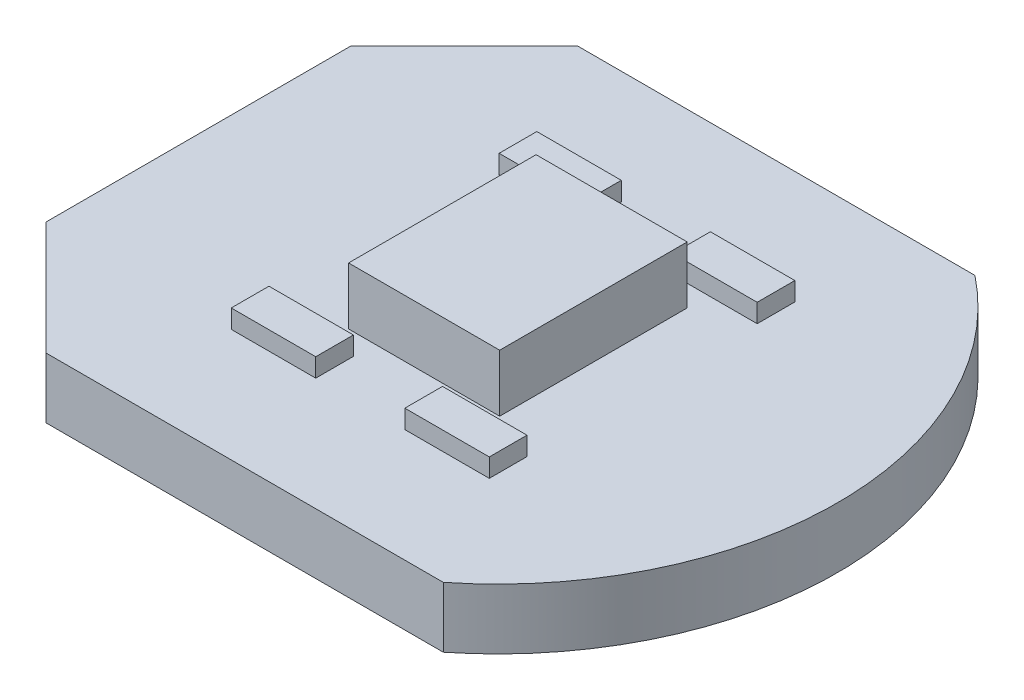
ISO-10303-21;
HEADER;
FILE_DESCRIPTION(('STEP AP214'),'2;1');
FILE_NAME('part.step','',(''),(''),'','','');
FILE_SCHEMA(('AUTOMOTIVE_DESIGN { 1 0 10303 214 1 1 1 1 }'));
ENDSEC;
DATA;
#1=APPLICATION_CONTEXT('core data for automotive mechanical design processes');
#2=APPLICATION_PROTOCOL_DEFINITION('international standard','automotive_design',2000,#1);
#3=PRODUCT_CONTEXT('',#1,'mechanical');
#4=PRODUCT('Part','Part','',(#3));
#5=PRODUCT_RELATED_PRODUCT_CATEGORY('part','',(#4));
#6=PRODUCT_DEFINITION_FORMATION('','',#4);
#7=PRODUCT_DEFINITION_CONTEXT('part definition',#1,'design');
#8=PRODUCT_DEFINITION('design','',#6,#7);
#9=PRODUCT_DEFINITION_SHAPE('','',#8);
#10=(LENGTH_UNIT() NAMED_UNIT(*) SI_UNIT(.MILLI.,.METRE.));
#11=(NAMED_UNIT(*) PLANE_ANGLE_UNIT() SI_UNIT($,.RADIAN.));
#12=(NAMED_UNIT(*) SI_UNIT($,.STERADIAN.) SOLID_ANGLE_UNIT());
#13=UNCERTAINTY_MEASURE_WITH_UNIT(LENGTH_MEASURE(1.E-05),#10,'distance_accuracy_value','');
#14=(GEOMETRIC_REPRESENTATION_CONTEXT(3) GLOBAL_UNCERTAINTY_ASSIGNED_CONTEXT((#13)) GLOBAL_UNIT_ASSIGNED_CONTEXT((#10,
#11,#12)) REPRESENTATION_CONTEXT('',''));
#15=CARTESIAN_POINT('',(0.,0.,0.));
#16=DIRECTION('',(0.,0.,1.));
#17=DIRECTION('',(1.,0.,0.));
#18=AXIS2_PLACEMENT_3D('',#15,#16,#17);
#19=CARTESIAN_POINT('',(-0.541544862518075,1.63,0.));
#20=DIRECTION('',(0.,-1.,0.));
#21=DIRECTION('',(0.,0.,-1.));
#22=AXIS2_PLACEMENT_3D('',#19,#20,#21);
#23=PLANE('',#22);
#24=DIRECTION('',(0.,0.,1.));
#25=VECTOR('',#24,1.);
#26=CARTESIAN_POINT('',(-3.605,1.63,-4.115));
#27=LINE('',#26,#25);
#28=CARTESIAN_POINT('',(-3.605,1.63,-4.115));
#29=VERTEX_POINT('',#28);
#30=CARTESIAN_POINT('',(-3.605,1.63,-3.1));
#31=VERTEX_POINT('',#30);
#32=EDGE_CURVE('E227',#29,#31,#27,.T.);
#33=ORIENTED_EDGE('',*,*,#32,.F.);
#34=DIRECTION('',(-1.,0.,0.));
#35=VECTOR('',#34,1.);
#36=CARTESIAN_POINT('',(-3.605,1.63,-4.115));
#37=LINE('',#36,#35);
#38=CARTESIAN_POINT('',(-1.33,1.63,-4.115));
#39=VERTEX_POINT('',#38);
#40=EDGE_CURVE('E240',#39,#29,#37,.T.);
#41=ORIENTED_EDGE('',*,*,#40,.F.);
#42=DIRECTION('',(0.,0.,-1.));
#43=VECTOR('',#42,1.);
#44=CARTESIAN_POINT('',(-1.33,1.63,-4.115));
#45=LINE('',#44,#43);
#46=CARTESIAN_POINT('',(-1.33,1.63,-3.1));
#47=VERTEX_POINT('',#46);
#48=EDGE_CURVE('E249',#47,#39,#45,.T.);
#49=ORIENTED_EDGE('',*,*,#48,.F.);
#50=DIRECTION('',(1.,0.,0.));
#51=VECTOR('',#50,1.);
#52=CARTESIAN_POINT('',(-3.605,1.63,-3.1));
#53=LINE('',#52,#51);
#54=EDGE_CURVE('E230',#31,#47,#53,.T.);
#55=ORIENTED_EDGE('',*,*,#54,.F.);
#56=EDGE_LOOP('',(#33,#41,#49,#55));
#57=FACE_BOUND('',#56,.T.);
#58=DIRECTION('',(0.,0.,-1.));
#59=VECTOR('',#58,1.);
#60=CARTESIAN_POINT('',(3.345,1.63,-4.115));
#61=LINE('',#60,#59);
#62=CARTESIAN_POINT('',(3.345,1.63,-3.1));
#63=VERTEX_POINT('',#62);
#64=CARTESIAN_POINT('',(3.345,1.63,-4.115));
#65=VERTEX_POINT('',#64);
#66=EDGE_CURVE('E298',#63,#65,#61,.T.);
#67=ORIENTED_EDGE('',*,*,#66,.F.);
#68=DIRECTION('',(1.,0.,0.));
#69=VECTOR('',#68,1.);
#70=CARTESIAN_POINT('',(3.345,1.63,-3.1));
#71=LINE('',#70,#69);
#72=CARTESIAN_POINT('',(1.07,1.63,-3.1));
#73=VERTEX_POINT('',#72);
#74=EDGE_CURVE('E303',#73,#63,#71,.T.);
#75=ORIENTED_EDGE('',*,*,#74,.F.);
#76=DIRECTION('',(0.,0.,1.));
#77=VECTOR('',#76,1.);
#78=CARTESIAN_POINT('',(1.07,1.63,-4.115));
#79=LINE('',#78,#77);
#80=CARTESIAN_POINT('',(1.07,1.63,-4.115));
#81=VERTEX_POINT('',#80);
#82=EDGE_CURVE('E315',#81,#73,#79,.T.);
#83=ORIENTED_EDGE('',*,*,#82,.F.);
#84=DIRECTION('',(-1.,0.,0.));
#85=VECTOR('',#84,1.);
#86=CARTESIAN_POINT('',(3.345,1.63,-4.115));
#87=LINE('',#86,#85);
#88=EDGE_CURVE('E312',#65,#81,#87,.T.);
#89=ORIENTED_EDGE('',*,*,#88,.F.);
#90=EDGE_LOOP('',(#67,#75,#83,#89));
#91=FACE_BOUND('',#90,.T.);
#92=DIRECTION('',(-0.707106781186546,0.,0.707106781186549));
#93=VECTOR('',#92,1.);
#94=CARTESIAN_POINT('',(-8.605,1.63,-4.105));
#95=LINE('',#94,#93);
#96=CARTESIAN_POINT('',(-5.55000000000001,1.63,-7.16));
#97=VERTEX_POINT('',#96);
#98=CARTESIAN_POINT('',(-8.605,1.63,-4.105));
#99=VERTEX_POINT('',#98);
#100=EDGE_CURVE('E365',#97,#99,#95,.T.);
#101=ORIENTED_EDGE('',*,*,#100,.T.);
#102=DIRECTION('',(0.,0.,1.));
#103=VECTOR('',#102,1.);
#104=CARTESIAN_POINT('',(-8.605,1.63,-4.105));
#105=LINE('',#104,#103);
#106=CARTESIAN_POINT('',(-8.605,1.63,4.105));
#107=VERTEX_POINT('',#106);
#108=EDGE_CURVE('E368',#99,#107,#105,.T.);
#109=ORIENTED_EDGE('',*,*,#108,.T.);
#110=DIRECTION('',(0.707106781186546,0.,0.707106781186549));
#111=VECTOR('',#110,1.);
#112=CARTESIAN_POINT('',(-8.605,1.63,4.105));
#113=LINE('',#112,#111);
#114=CARTESIAN_POINT('',(-5.55000000000001,1.63,7.16));
#115=VERTEX_POINT('',#114);
#116=EDGE_CURVE('E371',#107,#115,#113,.T.);
#117=ORIENTED_EDGE('',*,*,#116,.T.);
#118=DIRECTION('',(1.,0.,0.));
#119=VECTOR('',#118,1.);
#120=CARTESIAN_POINT('',(-5.55000000000001,1.63,7.16));
#121=LINE('',#120,#119);
#122=CARTESIAN_POINT('',(5.14999999999999,1.63,7.16));
#123=VERTEX_POINT('',#122);
#124=EDGE_CURVE('E373',#115,#123,#121,.T.);
#125=ORIENTED_EDGE('',*,*,#124,.T.);
#126=CARTESIAN_POINT('',(-0.541544862518075,1.63,0.));
#127=DIRECTION('',(0.,1.,0.));
#128=DIRECTION('',(0.,0.,-1.));
#129=AXIS2_PLACEMENT_3D('',#126,#127,#128);
#130=CIRCLE('',#129,9.14654486251808);
#131=CARTESIAN_POINT('',(5.14999999999999,1.63,-7.16));
#132=VERTEX_POINT('',#131);
#133=EDGE_CURVE('E375',#123,#132,#130,.T.);
#134=ORIENTED_EDGE('',*,*,#133,.T.);
#135=DIRECTION('',(-1.,0.,0.));
#136=VECTOR('',#135,1.);
#137=CARTESIAN_POINT('',(-5.55000000000001,1.63,-7.16));
#138=LINE('',#137,#136);
#139=EDGE_CURVE('E377',#132,#97,#138,.T.);
#140=ORIENTED_EDGE('',*,*,#139,.T.);
#141=EDGE_LOOP('',(#101,#109,#117,#125,#134,#140));
#142=FACE_BOUND('',#141,.T.);
#143=DIRECTION('',(0.,0.,-1.));
#144=VECTOR('',#143,1.);
#145=CARTESIAN_POINT('',(2.035,1.63,2.525));
#146=LINE('',#145,#144);
#147=CARTESIAN_POINT('',(2.035,1.63,2.525));
#148=VERTEX_POINT('',#147);
#149=CARTESIAN_POINT('',(2.035,1.63,-2.525));
#150=VERTEX_POINT('',#149);
#151=EDGE_CURVE('E331',#148,#150,#146,.T.);
#152=ORIENTED_EDGE('',*,*,#151,.F.);
#153=DIRECTION('',(1.,0.,0.));
#154=VECTOR('',#153,1.);
#155=CARTESIAN_POINT('',(-2.035,1.63,2.525));
#156=LINE('',#155,#154);
#157=CARTESIAN_POINT('',(-2.035,1.63,2.525));
#158=VERTEX_POINT('',#157);
#159=EDGE_CURVE('E336',#158,#148,#156,.T.);
#160=ORIENTED_EDGE('',*,*,#159,.F.);
#161=DIRECTION('',(0.,0.,1.));
#162=VECTOR('',#161,1.);
#163=CARTESIAN_POINT('',(-2.035,1.63,2.525));
#164=LINE('',#163,#162);
#165=CARTESIAN_POINT('',(-2.035,1.63,-2.525));
#166=VERTEX_POINT('',#165);
#167=EDGE_CURVE('E348',#166,#158,#164,.T.);
#168=ORIENTED_EDGE('',*,*,#167,.F.);
#169=DIRECTION('',(-1.,0.,0.));
#170=VECTOR('',#169,1.);
#171=CARTESIAN_POINT('',(-2.035,1.63,-2.525));
#172=LINE('',#171,#170);
#173=EDGE_CURVE('E345',#150,#166,#172,.T.);
#174=ORIENTED_EDGE('',*,*,#173,.F.);
#175=EDGE_LOOP('',(#152,#160,#168,#174));
#176=FACE_BOUND('',#175,.T.);
#177=DIRECTION('',(0.,0.,1.));
#178=VECTOR('',#177,1.);
#179=CARTESIAN_POINT('',(-3.605,1.63,4.115));
#180=LINE('',#179,#178);
#181=CARTESIAN_POINT('',(-3.605,1.63,3.1));
#182=VERTEX_POINT('',#181);
#183=CARTESIAN_POINT('',(-3.605,1.63,4.115));
#184=VERTEX_POINT('',#183);
#185=EDGE_CURVE('E265',#182,#184,#180,.T.);
#186=ORIENTED_EDGE('',*,*,#185,.F.);
#187=DIRECTION('',(-1.,0.,0.));
#188=VECTOR('',#187,1.);
#189=CARTESIAN_POINT('',(-3.605,1.63,3.1));
#190=LINE('',#189,#188);
#191=CARTESIAN_POINT('',(-1.33,1.63,3.1));
#192=VERTEX_POINT('',#191);
#193=EDGE_CURVE('E270',#192,#182,#190,.T.);
#194=ORIENTED_EDGE('',*,*,#193,.F.);
#195=DIRECTION('',(0.,0.,-1.));
#196=VECTOR('',#195,1.);
#197=CARTESIAN_POINT('',(-1.33,1.63,4.115));
#198=LINE('',#197,#196);
#199=CARTESIAN_POINT('',(-1.33,1.63,4.115));
#200=VERTEX_POINT('',#199);
#201=EDGE_CURVE('E282',#200,#192,#198,.T.);
#202=ORIENTED_EDGE('',*,*,#201,.F.);
#203=DIRECTION('',(1.,0.,0.));
#204=VECTOR('',#203,1.);
#205=CARTESIAN_POINT('',(-3.605,1.63,4.115));
#206=LINE('',#205,#204);
#207=EDGE_CURVE('E279',#184,#200,#206,.T.);
#208=ORIENTED_EDGE('',*,*,#207,.F.);
#209=EDGE_LOOP('',(#186,#194,#202,#208));
#210=FACE_BOUND('',#209,.T.);
#211=DIRECTION('',(0.,0.,-1.));
#212=VECTOR('',#211,1.);
#213=CARTESIAN_POINT('',(3.345,1.63,4.115));
#214=LINE('',#213,#212);
#215=CARTESIAN_POINT('',(3.345,1.63,4.115));
#216=VERTEX_POINT('',#215);
#217=CARTESIAN_POINT('',(3.345,1.63,3.1));
#218=VERTEX_POINT('',#217);
#219=EDGE_CURVE('E226',#216,#218,#214,.T.);
#220=ORIENTED_EDGE('',*,*,#219,.F.);
#221=DIRECTION('',(1.,0.,0.));
#222=VECTOR('',#221,1.);
#223=CARTESIAN_POINT('',(3.345,1.63,4.115));
#224=LINE('',#223,#222);
#225=CARTESIAN_POINT('',(1.07,1.63,4.115));
#226=VERTEX_POINT('',#225);
#227=EDGE_CURVE('E223',#226,#216,#224,.T.);
#228=ORIENTED_EDGE('',*,*,#227,.F.);
#229=DIRECTION('',(0.,0.,1.));
#230=VECTOR('',#229,1.);
#231=CARTESIAN_POINT('',(1.07,1.63,4.115));
#232=LINE('',#231,#230);
#233=CARTESIAN_POINT('',(1.07,1.63,3.1));
#234=VERTEX_POINT('',#233);
#235=EDGE_CURVE('E53',#234,#226,#232,.T.);
#236=ORIENTED_EDGE('',*,*,#235,.F.);
#237=DIRECTION('',(-1.,0.,0.));
#238=VECTOR('',#237,1.);
#239=CARTESIAN_POINT('',(3.345,1.63,3.1));
#240=LINE('',#239,#238);
#241=EDGE_CURVE('E48',#218,#234,#240,.T.);
#242=ORIENTED_EDGE('',*,*,#241,.F.);
#243=EDGE_LOOP('',(#220,#228,#236,#242));
#244=FACE_BOUND('',#243,.T.);
#245=ADVANCED_FACE('F33',(#57,#91,#142,#176,#210,#244),#23,.F.);
#246=CARTESIAN_POINT('',(-8.605,1.63,-4.105));
#247=DIRECTION('',(0.707106781186549,0.,0.707106781186546));
#248=DIRECTION('',(0.707106781186546,0.,-0.707106781186549));
#249=AXIS2_PLACEMENT_3D('',#246,#247,#248);
#250=PLANE('',#249);
#251=DIRECTION('',(-0.707106781186546,0.,0.707106781186549));
#252=VECTOR('',#251,1.);
#253=CARTESIAN_POINT('',(-8.605,0.,-4.105));
#254=LINE('',#253,#252);
#255=CARTESIAN_POINT('',(-5.55000000000001,0.,-7.16));
#256=VERTEX_POINT('',#255);
#257=CARTESIAN_POINT('',(-8.605,0.,-4.105));
#258=VERTEX_POINT('',#257);
#259=EDGE_CURVE('E364',#256,#258,#254,.T.);
#260=ORIENTED_EDGE('',*,*,#259,.T.);
#261=DIRECTION('',(0.,-1.,0.));
#262=VECTOR('',#261,1.);
#263=CARTESIAN_POINT('',(-8.605,1.63,-4.105));
#264=LINE('',#263,#262);
#265=EDGE_CURVE('E11',#99,#258,#264,.T.);
#266=ORIENTED_EDGE('',*,*,#265,.F.);
#267=ORIENTED_EDGE('',*,*,#100,.F.);
#268=DIRECTION('',(0.,-1.,0.));
#269=VECTOR('',#268,1.);
#270=CARTESIAN_POINT('',(-5.55000000000001,1.63,-7.16));
#271=LINE('',#270,#269);
#272=EDGE_CURVE('E379',#97,#256,#271,.T.);
#273=ORIENTED_EDGE('',*,*,#272,.T.);
#274=EDGE_LOOP('',(#260,#266,#267,#273));
#275=FACE_BOUND('',#274,.T.);
#276=ADVANCED_FACE('F35',(#275),#250,.F.);
#277=CARTESIAN_POINT('',(-8.605,1.63,-4.105));
#278=DIRECTION('',(1.,0.,0.));
#279=DIRECTION('',(0.,0.,-1.));
#280=AXIS2_PLACEMENT_3D('',#277,#278,#279);
#281=PLANE('',#280);
#282=DIRECTION('',(0.,0.,1.));
#283=VECTOR('',#282,1.);
#284=CARTESIAN_POINT('',(-8.605,0.,-4.105));
#285=LINE('',#284,#283);
#286=CARTESIAN_POINT('',(-8.605,0.,4.105));
#287=VERTEX_POINT('',#286);
#288=EDGE_CURVE('E382',#258,#287,#285,.T.);
#289=ORIENTED_EDGE('',*,*,#288,.T.);
#290=DIRECTION('',(0.,-1.,0.));
#291=VECTOR('',#290,1.);
#292=CARTESIAN_POINT('',(-8.605,1.63,4.105));
#293=LINE('',#292,#291);
#294=EDGE_CURVE('E41',#107,#287,#293,.T.);
#295=ORIENTED_EDGE('',*,*,#294,.F.);
#296=ORIENTED_EDGE('',*,*,#108,.F.);
#297=ORIENTED_EDGE('',*,*,#265,.T.);
#298=EDGE_LOOP('',(#289,#295,#296,#297));
#299=FACE_BOUND('',#298,.T.);
#300=ADVANCED_FACE('F429',(#299),#281,.F.);
#301=CARTESIAN_POINT('',(-8.605,1.63,4.105));
#302=DIRECTION('',(0.707106781186549,0.,-0.707106781186546));
#303=DIRECTION('',(-0.707106781186546,0.,-0.707106781186549));
#304=AXIS2_PLACEMENT_3D('',#301,#302,#303);
#305=PLANE('',#304);
#306=DIRECTION('',(0.707106781186546,0.,0.707106781186549));
#307=VECTOR('',#306,1.);
#308=CARTESIAN_POINT('',(-8.605,0.,4.105));
#309=LINE('',#308,#307);
#310=CARTESIAN_POINT('',(-5.55000000000001,0.,7.16));
#311=VERTEX_POINT('',#310);
#312=EDGE_CURVE('E384',#287,#311,#309,.T.);
#313=ORIENTED_EDGE('',*,*,#312,.T.);
#314=DIRECTION('',(0.,-1.,0.));
#315=VECTOR('',#314,1.);
#316=CARTESIAN_POINT('',(-5.55000000000001,1.63,7.16));
#317=LINE('',#316,#315);
#318=EDGE_CURVE('E399',#115,#311,#317,.T.);
#319=ORIENTED_EDGE('',*,*,#318,.F.);
#320=ORIENTED_EDGE('',*,*,#116,.F.);
#321=ORIENTED_EDGE('',*,*,#294,.T.);
#322=EDGE_LOOP('',(#313,#319,#320,#321));
#323=FACE_BOUND('',#322,.T.);
#324=ADVANCED_FACE('F406',(#323),#305,.F.);
#325=CARTESIAN_POINT('',(-5.55000000000001,1.63,7.16));
#326=DIRECTION('',(0.,0.,-1.));
#327=DIRECTION('',(-1.,0.,0.));
#328=AXIS2_PLACEMENT_3D('',#325,#326,#327);
#329=PLANE('',#328);
#330=DIRECTION('',(1.,0.,0.));
#331=VECTOR('',#330,1.);
#332=CARTESIAN_POINT('',(-5.55000000000001,0.,7.16));
#333=LINE('',#332,#331);
#334=CARTESIAN_POINT('',(5.14999999999999,0.,7.16));
#335=VERTEX_POINT('',#334);
#336=EDGE_CURVE('E386',#311,#335,#333,.T.);
#337=ORIENTED_EDGE('',*,*,#336,.T.);
#338=DIRECTION('',(0.,-1.,0.));
#339=VECTOR('',#338,1.);
#340=CARTESIAN_POINT('',(5.14999999999999,1.63,7.16));
#341=LINE('',#340,#339);
#342=EDGE_CURVE('E396',#123,#335,#341,.T.);
#343=ORIENTED_EDGE('',*,*,#342,.F.);
#344=ORIENTED_EDGE('',*,*,#124,.F.);
#345=ORIENTED_EDGE('',*,*,#318,.T.);
#346=EDGE_LOOP('',(#337,#343,#344,#345));
#347=FACE_BOUND('',#346,.T.);
#348=ADVANCED_FACE('F417',(#347),#329,.F.);
#349=CARTESIAN_POINT('',(-0.541544862518075,1.63,0.));
#350=DIRECTION('',(0.,-1.,0.));
#351=DIRECTION('',(0.,0.,-1.));
#352=AXIS2_PLACEMENT_3D('',#349,#350,#351);
#353=CYLINDRICAL_SURFACE('',#352,9.14654486251808);
#354=CARTESIAN_POINT('',(-0.541544862518075,0.,0.));
#355=DIRECTION('',(0.,1.,0.));
#356=DIRECTION('',(0.,0.,-1.));
#357=AXIS2_PLACEMENT_3D('',#354,#355,#356);
#358=CIRCLE('',#357,9.14654486251808);
#359=CARTESIAN_POINT('',(5.14999999999999,0.,-7.16));
#360=VERTEX_POINT('',#359);
#361=EDGE_CURVE('E388',#335,#360,#358,.T.);
#362=ORIENTED_EDGE('',*,*,#361,.T.);
#363=DIRECTION('',(0.,-1.,0.));
#364=VECTOR('',#363,1.);
#365=CARTESIAN_POINT('',(5.14999999999999,1.63,-7.16));
#366=LINE('',#365,#364);
#367=EDGE_CURVE('E393',#132,#360,#366,.T.);
#368=ORIENTED_EDGE('',*,*,#367,.F.);
#369=ORIENTED_EDGE('',*,*,#133,.F.);
#370=ORIENTED_EDGE('',*,*,#342,.T.);
#371=EDGE_LOOP('',(#362,#368,#369,#370));
#372=FACE_BOUND('',#371,.T.);
#373=ADVANCED_FACE('F421',(#372),#353,.T.);
#374=CARTESIAN_POINT('',(-5.55000000000001,1.63,-7.16));
#375=DIRECTION('',(0.,0.,1.));
#376=DIRECTION('',(1.,0.,0.));
#377=AXIS2_PLACEMENT_3D('',#374,#375,#376);
#378=PLANE('',#377);
#379=DIRECTION('',(-1.,0.,0.));
#380=VECTOR('',#379,1.);
#381=CARTESIAN_POINT('',(-5.55000000000001,0.,-7.16));
#382=LINE('',#381,#380);
#383=EDGE_CURVE('E369',#360,#256,#382,.T.);
#384=ORIENTED_EDGE('',*,*,#383,.T.);
#385=ORIENTED_EDGE('',*,*,#272,.F.);
#386=ORIENTED_EDGE('',*,*,#139,.F.);
#387=ORIENTED_EDGE('',*,*,#367,.T.);
#388=EDGE_LOOP('',(#384,#385,#386,#387));
#389=FACE_BOUND('',#388,.T.);
#390=ADVANCED_FACE('F432',(#389),#378,.F.);
#391=CARTESIAN_POINT('',(-0.541544862518075,0.,0.));
#392=DIRECTION('',(0.,-1.,0.));
#393=DIRECTION('',(0.,0.,-1.));
#394=AXIS2_PLACEMENT_3D('',#391,#392,#393);
#395=PLANE('',#394);
#396=ORIENTED_EDGE('',*,*,#259,.F.);
#397=ORIENTED_EDGE('',*,*,#383,.F.);
#398=ORIENTED_EDGE('',*,*,#361,.F.);
#399=ORIENTED_EDGE('',*,*,#336,.F.);
#400=ORIENTED_EDGE('',*,*,#312,.F.);
#401=ORIENTED_EDGE('',*,*,#288,.F.);
#402=EDGE_LOOP('',(#396,#397,#398,#399,#400,#401));
#403=FACE_BOUND('',#402,.T.);
#404=ADVANCED_FACE('F412',(#403),#395,.T.);
#405=CARTESIAN_POINT('',(2.035,3.17,2.525));
#406=DIRECTION('',(-1.,0.,0.));
#407=DIRECTION('',(0.,0.,1.));
#408=AXIS2_PLACEMENT_3D('',#405,#406,#407);
#409=PLANE('',#408);
#410=ORIENTED_EDGE('',*,*,#151,.T.);
#411=DIRECTION('',(0.,-1.,0.));
#412=VECTOR('',#411,1.);
#413=CARTESIAN_POINT('',(2.035,3.17,-2.525));
#414=LINE('',#413,#412);
#415=CARTESIAN_POINT('',(2.035,3.17,-2.525));
#416=VERTEX_POINT('',#415);
#417=EDGE_CURVE('E361',#416,#150,#414,.T.);
#418=ORIENTED_EDGE('',*,*,#417,.F.);
#419=DIRECTION('',(0.,0.,-1.));
#420=VECTOR('',#419,1.);
#421=CARTESIAN_POINT('',(2.035,3.17,2.525));
#422=LINE('',#421,#420);
#423=CARTESIAN_POINT('',(2.035,3.17,2.525));
#424=VERTEX_POINT('',#423);
#425=EDGE_CURVE('E332',#424,#416,#422,.T.);
#426=ORIENTED_EDGE('',*,*,#425,.F.);
#427=DIRECTION('',(0.,-1.,0.));
#428=VECTOR('',#427,1.);
#429=CARTESIAN_POINT('',(2.035,3.17,2.525));
#430=LINE('',#429,#428);
#431=EDGE_CURVE('E342',#424,#148,#430,.T.);
#432=ORIENTED_EDGE('',*,*,#431,.T.);
#433=EDGE_LOOP('',(#410,#418,#426,#432));
#434=FACE_BOUND('',#433,.T.);
#435=ADVANCED_FACE('F439',(#434),#409,.F.);
#436=CARTESIAN_POINT('',(-2.035,3.17,-2.525));
#437=DIRECTION('',(0.,0.,1.));
#438=DIRECTION('',(1.,0.,0.));
#439=AXIS2_PLACEMENT_3D('',#436,#437,#438);
#440=PLANE('',#439);
#441=ORIENTED_EDGE('',*,*,#173,.T.);
#442=DIRECTION('',(0.,-1.,0.));
#443=VECTOR('',#442,1.);
#444=CARTESIAN_POINT('',(-2.035,3.17,-2.525));
#445=LINE('',#444,#443);
#446=CARTESIAN_POINT('',(-2.035,3.17,-2.525));
#447=VERTEX_POINT('',#446);
#448=EDGE_CURVE('E358',#447,#166,#445,.T.);
#449=ORIENTED_EDGE('',*,*,#448,.F.);
#450=DIRECTION('',(-1.,0.,0.));
#451=VECTOR('',#450,1.);
#452=CARTESIAN_POINT('',(-2.035,3.17,-2.525));
#453=LINE('',#452,#451);
#454=EDGE_CURVE('E335',#416,#447,#453,.T.);
#455=ORIENTED_EDGE('',*,*,#454,.F.);
#456=ORIENTED_EDGE('',*,*,#417,.T.);
#457=EDGE_LOOP('',(#441,#449,#455,#456));
#458=FACE_BOUND('',#457,.T.);
#459=ADVANCED_FACE('F452',(#458),#440,.F.);
#460=CARTESIAN_POINT('',(-2.035,3.17,2.525));
#461=DIRECTION('',(1.,0.,0.));
#462=DIRECTION('',(0.,0.,-1.));
#463=AXIS2_PLACEMENT_3D('',#460,#461,#462);
#464=PLANE('',#463);
#465=ORIENTED_EDGE('',*,*,#167,.T.);
#466=DIRECTION('',(0.,-1.,0.));
#467=VECTOR('',#466,1.);
#468=CARTESIAN_POINT('',(-2.035,3.17,2.525));
#469=LINE('',#468,#467);
#470=CARTESIAN_POINT('',(-2.035,3.17,2.525));
#471=VERTEX_POINT('',#470);
#472=EDGE_CURVE('E355',#471,#158,#469,.T.);
#473=ORIENTED_EDGE('',*,*,#472,.F.);
#474=DIRECTION('',(0.,0.,1.));
#475=VECTOR('',#474,1.);
#476=CARTESIAN_POINT('',(-2.035,3.17,2.525));
#477=LINE('',#476,#475);
#478=EDGE_CURVE('E338',#447,#471,#477,.T.);
#479=ORIENTED_EDGE('',*,*,#478,.F.);
#480=ORIENTED_EDGE('',*,*,#448,.T.);
#481=EDGE_LOOP('',(#465,#473,#479,#480));
#482=FACE_BOUND('',#481,.T.);
#483=ADVANCED_FACE('F456',(#482),#464,.F.);
#484=CARTESIAN_POINT('',(-2.035,3.17,2.525));
#485=DIRECTION('',(0.,0.,-1.));
#486=DIRECTION('',(-1.,0.,0.));
#487=AXIS2_PLACEMENT_3D('',#484,#485,#486);
#488=PLANE('',#487);
#489=ORIENTED_EDGE('',*,*,#159,.T.);
#490=ORIENTED_EDGE('',*,*,#431,.F.);
#491=DIRECTION('',(1.,0.,0.));
#492=VECTOR('',#491,1.);
#493=CARTESIAN_POINT('',(-2.035,3.17,2.525));
#494=LINE('',#493,#492);
#495=EDGE_CURVE('E340',#471,#424,#494,.T.);
#496=ORIENTED_EDGE('',*,*,#495,.F.);
#497=ORIENTED_EDGE('',*,*,#472,.T.);
#498=EDGE_LOOP('',(#489,#490,#496,#497));
#499=FACE_BOUND('',#498,.T.);
#500=ADVANCED_FACE('F460',(#499),#488,.F.);
#501=CARTESIAN_POINT('',(0.,3.17,0.));
#502=DIRECTION('',(0.,-1.,0.));
#503=DIRECTION('',(0.,0.,-1.));
#504=AXIS2_PLACEMENT_3D('',#501,#502,#503);
#505=PLANE('',#504);
#506=ORIENTED_EDGE('',*,*,#425,.T.);
#507=ORIENTED_EDGE('',*,*,#454,.T.);
#508=ORIENTED_EDGE('',*,*,#478,.T.);
#509=ORIENTED_EDGE('',*,*,#495,.T.);
#510=EDGE_LOOP('',(#506,#507,#508,#509));
#511=FACE_BOUND('',#510,.T.);
#512=ADVANCED_FACE('F464',(#511),#505,.F.);
#513=CARTESIAN_POINT('',(3.345,2.13,-4.115));
#514=DIRECTION('',(-1.,0.,0.));
#515=DIRECTION('',(0.,0.,1.));
#516=AXIS2_PLACEMENT_3D('',#513,#514,#515);
#517=PLANE('',#516);
#518=ORIENTED_EDGE('',*,*,#66,.T.);
#519=DIRECTION('',(0.,-1.,0.));
#520=VECTOR('',#519,1.);
#521=CARTESIAN_POINT('',(3.345,2.13,-4.115));
#522=LINE('',#521,#520);
#523=CARTESIAN_POINT('',(3.345,2.13,-4.115));
#524=VERTEX_POINT('',#523);
#525=EDGE_CURVE('E328',#524,#65,#522,.T.);
#526=ORIENTED_EDGE('',*,*,#525,.F.);
#527=DIRECTION('',(0.,0.,-1.));
#528=VECTOR('',#527,1.);
#529=CARTESIAN_POINT('',(3.345,2.13,-4.115));
#530=LINE('',#529,#528);
#531=CARTESIAN_POINT('',(3.345,2.13,-3.1));
#532=VERTEX_POINT('',#531);
#533=EDGE_CURVE('E299',#532,#524,#530,.T.);
#534=ORIENTED_EDGE('',*,*,#533,.F.);
#535=DIRECTION('',(0.,-1.,0.));
#536=VECTOR('',#535,1.);
#537=CARTESIAN_POINT('',(3.345,2.13,-3.1));
#538=LINE('',#537,#536);
#539=EDGE_CURVE('E309',#532,#63,#538,.T.);
#540=ORIENTED_EDGE('',*,*,#539,.T.);
#541=EDGE_LOOP('',(#518,#526,#534,#540));
#542=FACE_BOUND('',#541,.T.);
#543=ADVANCED_FACE('F468',(#542),#517,.F.);
#544=CARTESIAN_POINT('',(3.345,2.13,-4.115));
#545=DIRECTION('',(0.,0.,1.));
#546=DIRECTION('',(1.,0.,0.));
#547=AXIS2_PLACEMENT_3D('',#544,#545,#546);
#548=PLANE('',#547);
#549=ORIENTED_EDGE('',*,*,#88,.T.);
#550=DIRECTION('',(0.,-1.,0.));
#551=VECTOR('',#550,1.);
#552=CARTESIAN_POINT('',(1.07,2.13,-4.115));
#553=LINE('',#552,#551);
#554=CARTESIAN_POINT('',(1.07,2.13,-4.115));
#555=VERTEX_POINT('',#554);
#556=EDGE_CURVE('E325',#555,#81,#553,.T.);
#557=ORIENTED_EDGE('',*,*,#556,.F.);
#558=DIRECTION('',(-1.,0.,0.));
#559=VECTOR('',#558,1.);
#560=CARTESIAN_POINT('',(3.345,2.13,-4.115));
#561=LINE('',#560,#559);
#562=EDGE_CURVE('E302',#524,#555,#561,.T.);
#563=ORIENTED_EDGE('',*,*,#562,.F.);
#564=ORIENTED_EDGE('',*,*,#525,.T.);
#565=EDGE_LOOP('',(#549,#557,#563,#564));
#566=FACE_BOUND('',#565,.T.);
#567=ADVANCED_FACE('F472',(#566),#548,.F.);
#568=CARTESIAN_POINT('',(1.07,2.13,-4.115));
#569=DIRECTION('',(1.,0.,0.));
#570=DIRECTION('',(0.,0.,-1.));
#571=AXIS2_PLACEMENT_3D('',#568,#569,#570);
#572=PLANE('',#571);
#573=ORIENTED_EDGE('',*,*,#82,.T.);
#574=DIRECTION('',(0.,-1.,0.));
#575=VECTOR('',#574,1.);
#576=CARTESIAN_POINT('',(1.07,2.13,-3.1));
#577=LINE('',#576,#575);
#578=CARTESIAN_POINT('',(1.07,2.13,-3.1));
#579=VERTEX_POINT('',#578);
#580=EDGE_CURVE('E322',#579,#73,#577,.T.);
#581=ORIENTED_EDGE('',*,*,#580,.F.);
#582=DIRECTION('',(0.,0.,1.));
#583=VECTOR('',#582,1.);
#584=CARTESIAN_POINT('',(1.07,2.13,-4.115));
#585=LINE('',#584,#583);
#586=EDGE_CURVE('E305',#555,#579,#585,.T.);
#587=ORIENTED_EDGE('',*,*,#586,.F.);
#588=ORIENTED_EDGE('',*,*,#556,.T.);
#589=EDGE_LOOP('',(#573,#581,#587,#588));
#590=FACE_BOUND('',#589,.T.);
#591=ADVANCED_FACE('F476',(#590),#572,.F.);
#592=CARTESIAN_POINT('',(3.345,2.13,-3.1));
#593=DIRECTION('',(0.,0.,-1.));
#594=DIRECTION('',(-1.,0.,0.));
#595=AXIS2_PLACEMENT_3D('',#592,#593,#594);
#596=PLANE('',#595);
#597=ORIENTED_EDGE('',*,*,#74,.T.);
#598=ORIENTED_EDGE('',*,*,#539,.F.);
#599=DIRECTION('',(1.,0.,0.));
#600=VECTOR('',#599,1.);
#601=CARTESIAN_POINT('',(3.345,2.13,-3.1));
#602=LINE('',#601,#600);
#603=EDGE_CURVE('E307',#579,#532,#602,.T.);
#604=ORIENTED_EDGE('',*,*,#603,.F.);
#605=ORIENTED_EDGE('',*,*,#580,.T.);
#606=EDGE_LOOP('',(#597,#598,#604,#605));
#607=FACE_BOUND('',#606,.T.);
#608=ADVANCED_FACE('F480',(#607),#596,.F.);
#609=CARTESIAN_POINT('',(0.,2.13,0.));
#610=DIRECTION('',(0.,-1.,0.));
#611=DIRECTION('',(0.,0.,-1.));
#612=AXIS2_PLACEMENT_3D('',#609,#610,#611);
#613=PLANE('',#612);
#614=ORIENTED_EDGE('',*,*,#533,.T.);
#615=ORIENTED_EDGE('',*,*,#562,.T.);
#616=ORIENTED_EDGE('',*,*,#586,.T.);
#617=ORIENTED_EDGE('',*,*,#603,.T.);
#618=EDGE_LOOP('',(#614,#615,#616,#617));
#619=FACE_BOUND('',#618,.T.);
#620=ADVANCED_FACE('F484',(#619),#613,.F.);
#621=CARTESIAN_POINT('',(-3.605,2.13,4.115));
#622=DIRECTION('',(1.,0.,0.));
#623=DIRECTION('',(0.,0.,-1.));
#624=AXIS2_PLACEMENT_3D('',#621,#622,#623);
#625=PLANE('',#624);
#626=ORIENTED_EDGE('',*,*,#185,.T.);
#627=DIRECTION('',(0.,-1.,0.));
#628=VECTOR('',#627,1.);
#629=CARTESIAN_POINT('',(-3.605,2.13,4.115));
#630=LINE('',#629,#628);
#631=CARTESIAN_POINT('',(-3.605,2.13,4.115));
#632=VERTEX_POINT('',#631);
#633=EDGE_CURVE('E295',#632,#184,#630,.T.);
#634=ORIENTED_EDGE('',*,*,#633,.F.);
#635=DIRECTION('',(0.,0.,1.));
#636=VECTOR('',#635,1.);
#637=CARTESIAN_POINT('',(-3.605,2.13,4.115));
#638=LINE('',#637,#636);
#639=CARTESIAN_POINT('',(-3.605,2.13,3.1));
#640=VERTEX_POINT('',#639);
#641=EDGE_CURVE('E266',#640,#632,#638,.T.);
#642=ORIENTED_EDGE('',*,*,#641,.F.);
#643=DIRECTION('',(0.,-1.,0.));
#644=VECTOR('',#643,1.);
#645=CARTESIAN_POINT('',(-3.605,2.13,3.1));
#646=LINE('',#645,#644);
#647=EDGE_CURVE('E276',#640,#182,#646,.T.);
#648=ORIENTED_EDGE('',*,*,#647,.T.);
#649=EDGE_LOOP('',(#626,#634,#642,#648));
#650=FACE_BOUND('',#649,.T.);
#651=ADVANCED_FACE('F488',(#650),#625,.F.);
#652=CARTESIAN_POINT('',(-3.605,2.13,4.115));
#653=DIRECTION('',(0.,0.,-1.));
#654=DIRECTION('',(-1.,0.,0.));
#655=AXIS2_PLACEMENT_3D('',#652,#653,#654);
#656=PLANE('',#655);
#657=ORIENTED_EDGE('',*,*,#207,.T.);
#658=DIRECTION('',(0.,-1.,0.));
#659=VECTOR('',#658,1.);
#660=CARTESIAN_POINT('',(-1.33,2.13,4.115));
#661=LINE('',#660,#659);
#662=CARTESIAN_POINT('',(-1.33,2.13,4.115));
#663=VERTEX_POINT('',#662);
#664=EDGE_CURVE('E292',#663,#200,#661,.T.);
#665=ORIENTED_EDGE('',*,*,#664,.F.);
#666=DIRECTION('',(1.,0.,0.));
#667=VECTOR('',#666,1.);
#668=CARTESIAN_POINT('',(-3.605,2.13,4.115));
#669=LINE('',#668,#667);
#670=EDGE_CURVE('E269',#632,#663,#669,.T.);
#671=ORIENTED_EDGE('',*,*,#670,.F.);
#672=ORIENTED_EDGE('',*,*,#633,.T.);
#673=EDGE_LOOP('',(#657,#665,#671,#672));
#674=FACE_BOUND('',#673,.T.);
#675=ADVANCED_FACE('F492',(#674),#656,.F.);
#676=CARTESIAN_POINT('',(-1.33,2.13,4.115));
#677=DIRECTION('',(-1.,0.,0.));
#678=DIRECTION('',(0.,0.,1.));
#679=AXIS2_PLACEMENT_3D('',#676,#677,#678);
#680=PLANE('',#679);
#681=ORIENTED_EDGE('',*,*,#201,.T.);
#682=DIRECTION('',(0.,-1.,0.));
#683=VECTOR('',#682,1.);
#684=CARTESIAN_POINT('',(-1.33,2.13,3.1));
#685=LINE('',#684,#683);
#686=CARTESIAN_POINT('',(-1.33,2.13,3.1));
#687=VERTEX_POINT('',#686);
#688=EDGE_CURVE('E289',#687,#192,#685,.T.);
#689=ORIENTED_EDGE('',*,*,#688,.F.);
#690=DIRECTION('',(0.,0.,-1.));
#691=VECTOR('',#690,1.);
#692=CARTESIAN_POINT('',(-1.33,2.13,4.115));
#693=LINE('',#692,#691);
#694=EDGE_CURVE('E272',#663,#687,#693,.T.);
#695=ORIENTED_EDGE('',*,*,#694,.F.);
#696=ORIENTED_EDGE('',*,*,#664,.T.);
#697=EDGE_LOOP('',(#681,#689,#695,#696));
#698=FACE_BOUND('',#697,.T.);
#699=ADVANCED_FACE('F496',(#698),#680,.F.);
#700=CARTESIAN_POINT('',(-3.605,2.13,3.1));
#701=DIRECTION('',(0.,0.,1.));
#702=DIRECTION('',(1.,0.,0.));
#703=AXIS2_PLACEMENT_3D('',#700,#701,#702);
#704=PLANE('',#703);
#705=ORIENTED_EDGE('',*,*,#193,.T.);
#706=ORIENTED_EDGE('',*,*,#647,.F.);
#707=DIRECTION('',(-1.,0.,0.));
#708=VECTOR('',#707,1.);
#709=CARTESIAN_POINT('',(-3.605,2.13,3.1));
#710=LINE('',#709,#708);
#711=EDGE_CURVE('E274',#687,#640,#710,.T.);
#712=ORIENTED_EDGE('',*,*,#711,.F.);
#713=ORIENTED_EDGE('',*,*,#688,.T.);
#714=EDGE_LOOP('',(#705,#706,#712,#713));
#715=FACE_BOUND('',#714,.T.);
#716=ADVANCED_FACE('F500',(#715),#704,.F.);
#717=CARTESIAN_POINT('',(0.,2.13,0.));
#718=DIRECTION('',(0.,-1.,0.));
#719=DIRECTION('',(0.,0.,-1.));
#720=AXIS2_PLACEMENT_3D('',#717,#718,#719);
#721=PLANE('',#720);
#722=ORIENTED_EDGE('',*,*,#641,.T.);
#723=ORIENTED_EDGE('',*,*,#670,.T.);
#724=ORIENTED_EDGE('',*,*,#694,.T.);
#725=ORIENTED_EDGE('',*,*,#711,.T.);
#726=EDGE_LOOP('',(#722,#723,#724,#725));
#727=FACE_BOUND('',#726,.T.);
#728=ADVANCED_FACE('F504',(#727),#721,.F.);
#729=CARTESIAN_POINT('',(-3.605,2.13,-4.115));
#730=DIRECTION('',(1.,0.,0.));
#731=DIRECTION('',(0.,0.,-1.));
#732=AXIS2_PLACEMENT_3D('',#729,#730,#731);
#733=PLANE('',#732);
#734=ORIENTED_EDGE('',*,*,#32,.T.);
#735=DIRECTION('',(0.,-1.,0.));
#736=VECTOR('',#735,1.);
#737=CARTESIAN_POINT('',(-3.605,2.13,-3.1));
#738=LINE('',#737,#736);
#739=CARTESIAN_POINT('',(-3.605,2.13,-3.1));
#740=VERTEX_POINT('',#739);
#741=EDGE_CURVE('E262',#740,#31,#738,.T.);
#742=ORIENTED_EDGE('',*,*,#741,.F.);
#743=DIRECTION('',(0.,0.,1.));
#744=VECTOR('',#743,1.);
#745=CARTESIAN_POINT('',(-3.605,2.13,-4.115));
#746=LINE('',#745,#744);
#747=CARTESIAN_POINT('',(-3.605,2.13,-4.115));
#748=VERTEX_POINT('',#747);
#749=EDGE_CURVE('E236',#748,#740,#746,.T.);
#750=ORIENTED_EDGE('',*,*,#749,.F.);
#751=DIRECTION('',(0.,-1.,0.));
#752=VECTOR('',#751,1.);
#753=CARTESIAN_POINT('',(-3.605,2.13,-4.115));
#754=LINE('',#753,#752);
#755=EDGE_CURVE('E245',#748,#29,#754,.T.);
#756=ORIENTED_EDGE('',*,*,#755,.T.);
#757=EDGE_LOOP('',(#734,#742,#750,#756));
#758=FACE_BOUND('',#757,.T.);
#759=ADVANCED_FACE('F508',(#758),#733,.F.);
#760=CARTESIAN_POINT('',(-3.605,2.13,-3.1));
#761=DIRECTION('',(0.,0.,-1.));
#762=DIRECTION('',(-1.,0.,0.));
#763=AXIS2_PLACEMENT_3D('',#760,#761,#762);
#764=PLANE('',#763);
#765=ORIENTED_EDGE('',*,*,#54,.T.);
#766=DIRECTION('',(0.,-1.,0.));
#767=VECTOR('',#766,1.);
#768=CARTESIAN_POINT('',(-1.33,2.13,-3.1));
#769=LINE('',#768,#767);
#770=CARTESIAN_POINT('',(-1.33,2.13,-3.1));
#771=VERTEX_POINT('',#770);
#772=EDGE_CURVE('E259',#771,#47,#769,.T.);
#773=ORIENTED_EDGE('',*,*,#772,.F.);
#774=DIRECTION('',(1.,0.,0.));
#775=VECTOR('',#774,1.);
#776=CARTESIAN_POINT('',(-3.605,2.13,-3.1));
#777=LINE('',#776,#775);
#778=EDGE_CURVE('E239',#740,#771,#777,.T.);
#779=ORIENTED_EDGE('',*,*,#778,.F.);
#780=ORIENTED_EDGE('',*,*,#741,.T.);
#781=EDGE_LOOP('',(#765,#773,#779,#780));
#782=FACE_BOUND('',#781,.T.);
#783=ADVANCED_FACE('F512',(#782),#764,.F.);
#784=CARTESIAN_POINT('',(-1.33,2.13,-4.115));
#785=DIRECTION('',(-1.,0.,0.));
#786=DIRECTION('',(0.,0.,1.));
#787=AXIS2_PLACEMENT_3D('',#784,#785,#786);
#788=PLANE('',#787);
#789=ORIENTED_EDGE('',*,*,#48,.T.);
#790=DIRECTION('',(0.,-1.,0.));
#791=VECTOR('',#790,1.);
#792=CARTESIAN_POINT('',(-1.33,2.13,-4.115));
#793=LINE('',#792,#791);
#794=CARTESIAN_POINT('',(-1.33,2.13,-4.115));
#795=VERTEX_POINT('',#794);
#796=EDGE_CURVE('E256',#795,#39,#793,.T.);
#797=ORIENTED_EDGE('',*,*,#796,.F.);
#798=DIRECTION('',(0.,0.,-1.));
#799=VECTOR('',#798,1.);
#800=CARTESIAN_POINT('',(-1.33,2.13,-4.115));
#801=LINE('',#800,#799);
#802=EDGE_CURVE('E242',#771,#795,#801,.T.);
#803=ORIENTED_EDGE('',*,*,#802,.F.);
#804=ORIENTED_EDGE('',*,*,#772,.T.);
#805=EDGE_LOOP('',(#789,#797,#803,#804));
#806=FACE_BOUND('',#805,.T.);
#807=ADVANCED_FACE('F516',(#806),#788,.F.);
#808=CARTESIAN_POINT('',(-3.605,2.13,-4.115));
#809=DIRECTION('',(0.,0.,1.));
#810=DIRECTION('',(1.,0.,0.));
#811=AXIS2_PLACEMENT_3D('',#808,#809,#810);
#812=PLANE('',#811);
#813=ORIENTED_EDGE('',*,*,#40,.T.);
#814=ORIENTED_EDGE('',*,*,#755,.F.);
#815=DIRECTION('',(-1.,0.,0.));
#816=VECTOR('',#815,1.);
#817=CARTESIAN_POINT('',(-3.605,2.13,-4.115));
#818=LINE('',#817,#816);
#819=EDGE_CURVE('E244',#795,#748,#818,.T.);
#820=ORIENTED_EDGE('',*,*,#819,.F.);
#821=ORIENTED_EDGE('',*,*,#796,.T.);
#822=EDGE_LOOP('',(#813,#814,#820,#821));
#823=FACE_BOUND('',#822,.T.);
#824=ADVANCED_FACE('F520',(#823),#812,.F.);
#825=CARTESIAN_POINT('',(0.,2.13,0.));
#826=DIRECTION('',(0.,1.,0.));
#827=DIRECTION('',(0.,0.,1.));
#828=AXIS2_PLACEMENT_3D('',#825,#826,#827);
#829=PLANE('',#828);
#830=ORIENTED_EDGE('',*,*,#749,.T.);
#831=ORIENTED_EDGE('',*,*,#778,.T.);
#832=ORIENTED_EDGE('',*,*,#802,.T.);
#833=ORIENTED_EDGE('',*,*,#819,.T.);
#834=EDGE_LOOP('',(#830,#831,#832,#833));
#835=FACE_BOUND('',#834,.T.);
#836=ADVANCED_FACE('F524',(#835),#829,.T.);
#837=CARTESIAN_POINT('',(3.345,2.13,4.115));
#838=DIRECTION('',(-1.,0.,0.));
#839=DIRECTION('',(0.,0.,1.));
#840=AXIS2_PLACEMENT_3D('',#837,#838,#839);
#841=PLANE('',#840);
#842=ORIENTED_EDGE('',*,*,#219,.T.);
#843=DIRECTION('',(0.,-1.,0.));
#844=VECTOR('',#843,1.);
#845=CARTESIAN_POINT('',(3.345,2.13,3.1));
#846=LINE('',#845,#844);
#847=CARTESIAN_POINT('',(3.345,2.13,3.1));
#848=VERTEX_POINT('',#847);
#849=EDGE_CURVE('E207',#848,#218,#846,.T.);
#850=ORIENTED_EDGE('',*,*,#849,.F.);
#851=DIRECTION('',(0.,0.,-1.));
#852=VECTOR('',#851,1.);
#853=CARTESIAN_POINT('',(3.345,2.13,4.115));
#854=LINE('',#853,#852);
#855=CARTESIAN_POINT('',(3.345,2.13,4.115));
#856=VERTEX_POINT('',#855);
#857=EDGE_CURVE('E214',#856,#848,#854,.T.);
#858=ORIENTED_EDGE('',*,*,#857,.F.);
#859=DIRECTION('',(0.,-1.,0.));
#860=VECTOR('',#859,1.);
#861=CARTESIAN_POINT('',(3.345,2.13,4.115));
#862=LINE('',#861,#860);
#863=EDGE_CURVE('E743',#856,#216,#862,.T.);
#864=ORIENTED_EDGE('',*,*,#863,.T.);
#865=EDGE_LOOP('',(#842,#850,#858,#864));
#866=FACE_BOUND('',#865,.T.);
#867=ADVANCED_FACE('F225',(#866),#841,.F.);
#868=CARTESIAN_POINT('',(3.345,2.13,3.1));
#869=DIRECTION('',(0.,0.,1.));
#870=DIRECTION('',(1.,0.,0.));
#871=AXIS2_PLACEMENT_3D('',#868,#869,#870);
#872=PLANE('',#871);
#873=ORIENTED_EDGE('',*,*,#241,.T.);
#874=DIRECTION('',(0.,-1.,0.));
#875=VECTOR('',#874,1.);
#876=CARTESIAN_POINT('',(1.07,2.13,3.1));
#877=LINE('',#876,#875);
#878=CARTESIAN_POINT('',(1.07,2.13,3.1));
#879=VERTEX_POINT('',#878);
#880=EDGE_CURVE('E210',#879,#234,#877,.T.);
#881=ORIENTED_EDGE('',*,*,#880,.F.);
#882=DIRECTION('',(-1.,0.,0.));
#883=VECTOR('',#882,1.);
#884=CARTESIAN_POINT('',(3.345,2.13,3.1));
#885=LINE('',#884,#883);
#886=EDGE_CURVE('E203',#848,#879,#885,.T.);
#887=ORIENTED_EDGE('',*,*,#886,.F.);
#888=ORIENTED_EDGE('',*,*,#849,.T.);
#889=EDGE_LOOP('',(#873,#881,#887,#888));
#890=FACE_BOUND('',#889,.T.);
#891=ADVANCED_FACE('F205',(#890),#872,.F.);
#892=CARTESIAN_POINT('',(1.07,2.13,4.115));
#893=DIRECTION('',(1.,0.,0.));
#894=DIRECTION('',(0.,0.,-1.));
#895=AXIS2_PLACEMENT_3D('',#892,#893,#894);
#896=PLANE('',#895);
#897=ORIENTED_EDGE('',*,*,#235,.T.);
#898=DIRECTION('',(0.,-1.,0.));
#899=VECTOR('',#898,1.);
#900=CARTESIAN_POINT('',(1.07,2.13,4.115));
#901=LINE('',#900,#899);
#902=CARTESIAN_POINT('',(1.07,2.13,4.115));
#903=VERTEX_POINT('',#902);
#904=EDGE_CURVE('E232',#903,#226,#901,.T.);
#905=ORIENTED_EDGE('',*,*,#904,.F.);
#906=DIRECTION('',(0.,0.,1.));
#907=VECTOR('',#906,1.);
#908=CARTESIAN_POINT('',(1.07,2.13,4.115));
#909=LINE('',#908,#907);
#910=EDGE_CURVE('E213',#879,#903,#909,.T.);
#911=ORIENTED_EDGE('',*,*,#910,.F.);
#912=ORIENTED_EDGE('',*,*,#880,.T.);
#913=EDGE_LOOP('',(#897,#905,#911,#912));
#914=FACE_BOUND('',#913,.T.);
#915=ADVANCED_FACE('F533',(#914),#896,.F.);
#916=CARTESIAN_POINT('',(3.345,2.13,4.115));
#917=DIRECTION('',(0.,0.,-1.));
#918=DIRECTION('',(-1.,0.,0.));
#919=AXIS2_PLACEMENT_3D('',#916,#917,#918);
#920=PLANE('',#919);
#921=ORIENTED_EDGE('',*,*,#227,.T.);
#922=ORIENTED_EDGE('',*,*,#863,.F.);
#923=DIRECTION('',(1.,0.,0.));
#924=VECTOR('',#923,1.);
#925=CARTESIAN_POINT('',(3.345,2.13,4.115));
#926=LINE('',#925,#924);
#927=EDGE_CURVE('E219',#903,#856,#926,.T.);
#928=ORIENTED_EDGE('',*,*,#927,.F.);
#929=ORIENTED_EDGE('',*,*,#904,.T.);
#930=EDGE_LOOP('',(#921,#922,#928,#929));
#931=FACE_BOUND('',#930,.T.);
#932=ADVANCED_FACE('F536',(#931),#920,.F.);
#933=CARTESIAN_POINT('',(0.,2.13,0.));
#934=DIRECTION('',(0.,1.,0.));
#935=DIRECTION('',(0.,0.,1.));
#936=AXIS2_PLACEMENT_3D('',#933,#934,#935);
#937=PLANE('',#936);
#938=ORIENTED_EDGE('',*,*,#857,.T.);
#939=ORIENTED_EDGE('',*,*,#886,.T.);
#940=ORIENTED_EDGE('',*,*,#910,.T.);
#941=ORIENTED_EDGE('',*,*,#927,.T.);
#942=EDGE_LOOP('',(#938,#939,#940,#941));
#943=FACE_BOUND('',#942,.T.);
#944=ADVANCED_FACE('F217',(#943),#937,.T.);
#945=CLOSED_SHELL('',(#245,#276,#300,#324,#348,#373,#390,#404,#435,#459,#483,#500,#512,#543,
#567,#591,#608,#620,#651,#675,#699,#716,#728,#759,#783,#807,#824,#836,#867,#891,#915,#932,#944));
#946=MANIFOLD_SOLID_BREP('B2',#945);
#947=ADVANCED_BREP_SHAPE_REPRESENTATION('',(#18,#946),#14);
#948=SHAPE_DEFINITION_REPRESENTATION(#9,#947);
ENDSEC;
END-ISO-10303-21;
